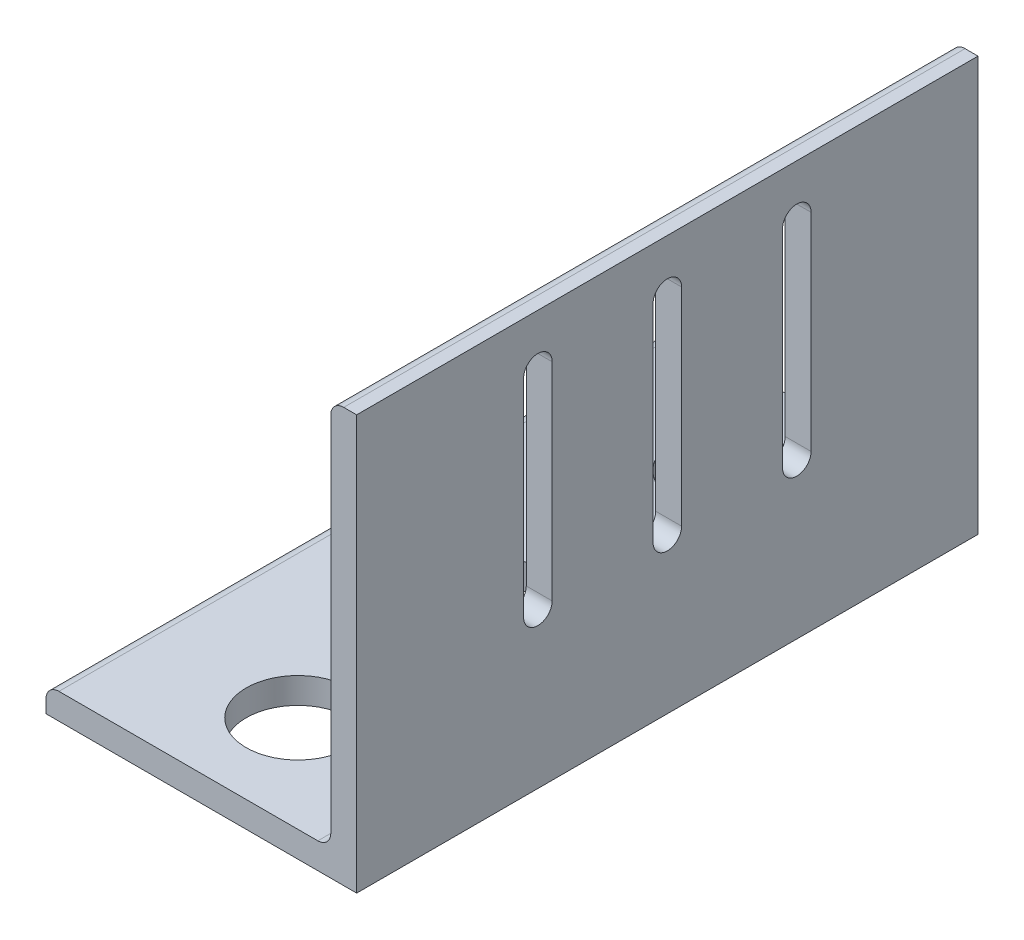
ISO-10303-21;
HEADER;
FILE_DESCRIPTION(('STEP AP214'),'2;1');
FILE_NAME('part.step','',(''),(''),'','','');
FILE_SCHEMA(('AUTOMOTIVE_DESIGN { 1 0 10303 214 1 1 1 1 }'));
ENDSEC;
DATA;
#1=APPLICATION_CONTEXT('core data for automotive mechanical design processes');
#2=APPLICATION_PROTOCOL_DEFINITION('international standard','automotive_design',2000,#1);
#3=PRODUCT_CONTEXT('',#1,'mechanical');
#4=PRODUCT('Part','Part','',(#3));
#5=PRODUCT_RELATED_PRODUCT_CATEGORY('part','',(#4));
#6=PRODUCT_DEFINITION_FORMATION('','',#4);
#7=PRODUCT_DEFINITION_CONTEXT('part definition',#1,'design');
#8=PRODUCT_DEFINITION('design','',#6,#7);
#9=PRODUCT_DEFINITION_SHAPE('','',#8);
#10=(LENGTH_UNIT() NAMED_UNIT(*) SI_UNIT(.MILLI.,.METRE.));
#11=(NAMED_UNIT(*) PLANE_ANGLE_UNIT() SI_UNIT($,.RADIAN.));
#12=(NAMED_UNIT(*) SI_UNIT($,.STERADIAN.) SOLID_ANGLE_UNIT());
#13=UNCERTAINTY_MEASURE_WITH_UNIT(LENGTH_MEASURE(1.E-05),#10,'distance_accuracy_value','');
#14=(GEOMETRIC_REPRESENTATION_CONTEXT(3) GLOBAL_UNCERTAINTY_ASSIGNED_CONTEXT((#13)) GLOBAL_UNIT_ASSIGNED_CONTEXT((#10,
#11,#12)) REPRESENTATION_CONTEXT('',''));
#15=CARTESIAN_POINT('',(0.,0.,0.));
#16=DIRECTION('',(0.,0.,1.));
#17=DIRECTION('',(1.,0.,0.));
#18=AXIS2_PLACEMENT_3D('',#15,#16,#17);
#19=CARTESIAN_POINT('',(-38.1,3.175,76.2));
#20=DIRECTION('',(1.,0.,0.));
#21=DIRECTION('',(0.,0.,-1.));
#22=AXIS2_PLACEMENT_3D('',#19,#20,#21);
#23=PLANE('',#22);
#24=DIRECTION('',(0.,-1.,0.));
#25=VECTOR('',#24,1.);
#26=CARTESIAN_POINT('',(-38.1,3.175,-76.2));
#27=LINE('',#26,#25);
#28=CARTESIAN_POINT('',(-38.1,3.175,-76.2));
#29=VERTEX_POINT('',#28);
#30=CARTESIAN_POINT('',(-38.1,0.,-76.2));
#31=VERTEX_POINT('',#30);
#32=EDGE_CURVE('E222',#29,#31,#27,.T.);
#33=ORIENTED_EDGE('',*,*,#32,.T.);
#34=DIRECTION('',(0.,0.,-1.));
#35=VECTOR('',#34,1.);
#36=CARTESIAN_POINT('',(-38.1,0.,76.2));
#37=LINE('',#36,#35);
#38=CARTESIAN_POINT('',(-38.1,0.,76.2));
#39=VERTEX_POINT('',#38);
#40=EDGE_CURVE('E368',#39,#31,#37,.T.);
#41=ORIENTED_EDGE('',*,*,#40,.F.);
#42=DIRECTION('',(0.,-1.,0.));
#43=VECTOR('',#42,1.);
#44=CARTESIAN_POINT('',(-38.1,3.175,76.2));
#45=LINE('',#44,#43);
#46=CARTESIAN_POINT('',(-38.1,3.175,76.2));
#47=VERTEX_POINT('',#46);
#48=EDGE_CURVE('E281',#47,#39,#45,.T.);
#49=ORIENTED_EDGE('',*,*,#48,.F.);
#50=DIRECTION('',(0.,0.,-1.));
#51=VECTOR('',#50,1.);
#52=CARTESIAN_POINT('',(-38.1,3.175,76.2));
#53=LINE('',#52,#51);
#54=EDGE_CURVE('E310',#47,#29,#53,.T.);
#55=ORIENTED_EDGE('',*,*,#54,.T.);
#56=EDGE_LOOP('',(#33,#41,#49,#55));
#57=FACE_BOUND('',#56,.T.);
#58=ADVANCED_FACE('F41',(#57),#23,.F.);
#59=CARTESIAN_POINT('',(-38.1,0.,76.2));
#60=DIRECTION('',(0.,1.,0.));
#61=DIRECTION('',(0.,0.,1.));
#62=AXIS2_PLACEMENT_3D('',#59,#60,#61);
#63=PLANE('',#62);
#64=CARTESIAN_POINT('',(0.,0.,-52.5));
#65=DIRECTION('',(0.,-1.,0.));
#66=DIRECTION('',(0.,0.,-1.));
#67=AXIS2_PLACEMENT_3D('',#64,#65,#66);
#68=CIRCLE('',#67,12.7);
#69=CARTESIAN_POINT('',(0.,0.,-65.2));
#70=VERTEX_POINT('',#69);
#71=EDGE_CURVE('E567',#70,#70,#68,.T.);
#72=ORIENTED_EDGE('',*,*,#71,.F.);
#73=EDGE_LOOP('',(#72));
#74=FACE_BOUND('',#73,.T.);
#75=CARTESIAN_POINT('',(0.,0.,52.5));
#76=DIRECTION('',(0.,-1.,0.));
#77=DIRECTION('',(0.,0.,-1.));
#78=AXIS2_PLACEMENT_3D('',#75,#76,#77);
#79=CIRCLE('',#78,12.7);
#80=CARTESIAN_POINT('',(0.,0.,39.8));
#81=VERTEX_POINT('',#80);
#82=EDGE_CURVE('E563',#81,#81,#79,.T.);
#83=ORIENTED_EDGE('',*,*,#82,.F.);
#84=EDGE_LOOP('',(#83));
#85=FACE_BOUND('',#84,.T.);
#86=CARTESIAN_POINT('',(0.,0.,0.));
#87=DIRECTION('',(0.,-1.,0.));
#88=DIRECTION('',(0.,0.,-1.));
#89=AXIS2_PLACEMENT_3D('',#86,#87,#88);
#90=CIRCLE('',#89,10.);
#91=CARTESIAN_POINT('',(0.,0.,-10.));
#92=VERTEX_POINT('',#91);
#93=EDGE_CURVE('E416',#92,#92,#90,.T.);
#94=ORIENTED_EDGE('',*,*,#93,.F.);
#95=EDGE_LOOP('',(#94));
#96=FACE_BOUND('',#95,.T.);
#97=DIRECTION('',(1.,0.,0.));
#98=VECTOR('',#97,1.);
#99=CARTESIAN_POINT('',(-38.1,0.,-76.2));
#100=LINE('',#99,#98);
#101=CARTESIAN_POINT('',(38.1,0.,-76.2));
#102=VERTEX_POINT('',#101);
#103=EDGE_CURVE('E314',#31,#102,#100,.T.);
#104=ORIENTED_EDGE('',*,*,#103,.T.);
#105=DIRECTION('',(0.,0.,-1.));
#106=VECTOR('',#105,1.);
#107=CARTESIAN_POINT('',(38.1,0.,76.2));
#108=LINE('',#107,#106);
#109=CARTESIAN_POINT('',(38.1,0.,76.2));
#110=VERTEX_POINT('',#109);
#111=EDGE_CURVE('E364',#110,#102,#108,.T.);
#112=ORIENTED_EDGE('',*,*,#111,.F.);
#113=DIRECTION('',(1.,0.,0.));
#114=VECTOR('',#113,1.);
#115=CARTESIAN_POINT('',(-38.1,0.,76.2));
#116=LINE('',#115,#114);
#117=EDGE_CURVE('E285',#39,#110,#116,.T.);
#118=ORIENTED_EDGE('',*,*,#117,.F.);
#119=ORIENTED_EDGE('',*,*,#40,.T.);
#120=EDGE_LOOP('',(#104,#112,#118,#119));
#121=FACE_BOUND('',#120,.T.);
#122=ADVANCED_FACE('F441',(#74,#85,#96,#121),#63,.F.);
#123=CARTESIAN_POINT('',(38.1,0.,76.2));
#124=DIRECTION('',(-1.,0.,0.));
#125=DIRECTION('',(0.,-1.,0.));
#126=AXIS2_PLACEMENT_3D('',#123,#124,#125);
#127=PLANE('',#126);
#128=DIRECTION('',(0.,-1.,0.));
#129=VECTOR('',#128,1.);
#130=CARTESIAN_POINT('',(38.1,88.9,35.25));
#131=LINE('',#130,#129);
#132=CARTESIAN_POINT('',(38.1,88.9,35.25));
#133=VERTEX_POINT('',#132);
#134=CARTESIAN_POINT('',(38.1,38.1,35.25));
#135=VERTEX_POINT('',#134);
#136=EDGE_CURVE('E204',#133,#135,#131,.T.);
#137=ORIENTED_EDGE('',*,*,#136,.F.);
#138=CARTESIAN_POINT('',(38.1,88.9,31.75));
#139=DIRECTION('',(1.,0.,0.));
#140=DIRECTION('',(0.,1.,0.));
#141=AXIS2_PLACEMENT_3D('',#138,#139,#140);
#142=CIRCLE('',#141,3.5);
#143=CARTESIAN_POINT('',(38.1,88.9,28.25));
#144=VERTEX_POINT('',#143);
#145=EDGE_CURVE('E58',#144,#133,#142,.T.);
#146=ORIENTED_EDGE('',*,*,#145,.F.);
#147=DIRECTION('',(0.,1.,0.));
#148=VECTOR('',#147,1.);
#149=CARTESIAN_POINT('',(38.1,88.9,28.25));
#150=LINE('',#149,#148);
#151=CARTESIAN_POINT('',(38.1,38.1,28.25));
#152=VERTEX_POINT('',#151);
#153=EDGE_CURVE('E212',#152,#144,#150,.T.);
#154=ORIENTED_EDGE('',*,*,#153,.F.);
#155=CARTESIAN_POINT('',(38.1,38.1,31.75));
#156=DIRECTION('',(1.,0.,0.));
#157=DIRECTION('',(0.,1.,0.));
#158=AXIS2_PLACEMENT_3D('',#155,#156,#157);
#159=CIRCLE('',#158,3.5);
#160=EDGE_CURVE('E193',#135,#152,#159,.T.);
#161=ORIENTED_EDGE('',*,*,#160,.F.);
#162=EDGE_LOOP('',(#137,#146,#154,#161));
#163=FACE_BOUND('',#162,.T.);
#164=DIRECTION('',(0.,-1.,0.));
#165=VECTOR('',#164,1.);
#166=CARTESIAN_POINT('',(38.1,88.9,-28.25));
#167=LINE('',#166,#165);
#168=CARTESIAN_POINT('',(38.1,88.9,-28.25));
#169=VERTEX_POINT('',#168);
#170=CARTESIAN_POINT('',(38.1,38.1,-28.25));
#171=VERTEX_POINT('',#170);
#172=EDGE_CURVE('E229',#169,#171,#167,.T.);
#173=ORIENTED_EDGE('',*,*,#172,.F.);
#174=CARTESIAN_POINT('',(38.1,88.9,-31.75));
#175=DIRECTION('',(1.,0.,0.));
#176=DIRECTION('',(0.,-1.,0.));
#177=AXIS2_PLACEMENT_3D('',#174,#175,#176);
#178=CIRCLE('',#177,3.5);
#179=CARTESIAN_POINT('',(38.1,88.9,-35.25));
#180=VERTEX_POINT('',#179);
#181=EDGE_CURVE('E66',#180,#169,#178,.T.);
#182=ORIENTED_EDGE('',*,*,#181,.F.);
#183=DIRECTION('',(0.,1.,0.));
#184=VECTOR('',#183,1.);
#185=CARTESIAN_POINT('',(38.1,88.9,-35.25));
#186=LINE('',#185,#184);
#187=CARTESIAN_POINT('',(38.1,38.1,-35.25));
#188=VERTEX_POINT('',#187);
#189=EDGE_CURVE('E238',#188,#180,#186,.T.);
#190=ORIENTED_EDGE('',*,*,#189,.F.);
#191=CARTESIAN_POINT('',(38.1,38.1,-31.75));
#192=DIRECTION('',(1.,0.,0.));
#193=DIRECTION('',(0.,-1.,0.));
#194=AXIS2_PLACEMENT_3D('',#191,#192,#193);
#195=CIRCLE('',#194,3.5);
#196=EDGE_CURVE('E234',#171,#188,#195,.T.);
#197=ORIENTED_EDGE('',*,*,#196,.F.);
#198=EDGE_LOOP('',(#173,#182,#190,#197));
#199=FACE_BOUND('',#198,.T.);
#200=DIRECTION('',(0.,-1.,0.));
#201=VECTOR('',#200,1.);
#202=CARTESIAN_POINT('',(38.1,88.9,3.5));
#203=LINE('',#202,#201);
#204=CARTESIAN_POINT('',(38.1,88.9,3.5));
#205=VERTEX_POINT('',#204);
#206=CARTESIAN_POINT('',(38.1,38.1,3.50000000000002));
#207=VERTEX_POINT('',#206);
#208=EDGE_CURVE('E257',#205,#207,#203,.T.);
#209=ORIENTED_EDGE('',*,*,#208,.F.);
#210=CARTESIAN_POINT('',(38.1,88.9,0.));
#211=DIRECTION('',(1.,0.,0.));
#212=DIRECTION('',(0.,1.,0.));
#213=AXIS2_PLACEMENT_3D('',#210,#211,#212);
#214=CIRCLE('',#213,3.5);
#215=CARTESIAN_POINT('',(38.1,88.9,-3.5));
#216=VERTEX_POINT('',#215);
#217=EDGE_CURVE('E254',#216,#205,#214,.T.);
#218=ORIENTED_EDGE('',*,*,#217,.F.);
#219=DIRECTION('',(0.,1.,0.));
#220=VECTOR('',#219,1.);
#221=CARTESIAN_POINT('',(38.1,88.9,-3.5));
#222=LINE('',#221,#220);
#223=CARTESIAN_POINT('',(38.1,38.1,-3.49999999999999));
#224=VERTEX_POINT('',#223);
#225=EDGE_CURVE('E265',#224,#216,#222,.T.);
#226=ORIENTED_EDGE('',*,*,#225,.F.);
#227=CARTESIAN_POINT('',(38.1,38.1,0.));
#228=DIRECTION('',(1.,0.,0.));
#229=DIRECTION('',(0.,1.,0.));
#230=AXIS2_PLACEMENT_3D('',#227,#228,#229);
#231=CIRCLE('',#230,3.5);
#232=EDGE_CURVE('E261',#207,#224,#231,.T.);
#233=ORIENTED_EDGE('',*,*,#232,.F.);
#234=EDGE_LOOP('',(#209,#218,#226,#233));
#235=FACE_BOUND('',#234,.T.);
#236=DIRECTION('',(0.,1.,0.));
#237=VECTOR('',#236,1.);
#238=CARTESIAN_POINT('',(38.1,0.,-76.2));
#239=LINE('',#238,#237);
#240=CARTESIAN_POINT('',(38.1,101.6,-76.2));
#241=VERTEX_POINT('',#240);
#242=EDGE_CURVE('E317',#102,#241,#239,.T.);
#243=ORIENTED_EDGE('',*,*,#242,.T.);
#244=DIRECTION('',(0.,0.,-1.));
#245=VECTOR('',#244,1.);
#246=CARTESIAN_POINT('',(38.1,101.6,76.2));
#247=LINE('',#246,#245);
#248=CARTESIAN_POINT('',(38.1,101.6,76.2));
#249=VERTEX_POINT('',#248);
#250=EDGE_CURVE('E360',#249,#241,#247,.T.);
#251=ORIENTED_EDGE('',*,*,#250,.F.);
#252=DIRECTION('',(0.,1.,0.));
#253=VECTOR('',#252,1.);
#254=CARTESIAN_POINT('',(38.1,0.,76.2));
#255=LINE('',#254,#253);
#256=EDGE_CURVE('E289',#110,#249,#255,.T.);
#257=ORIENTED_EDGE('',*,*,#256,.F.);
#258=ORIENTED_EDGE('',*,*,#111,.T.);
#259=EDGE_LOOP('',(#243,#251,#257,#258));
#260=FACE_BOUND('',#259,.T.);
#261=ADVANCED_FACE('F209',(#163,#199,#235,#260),#127,.F.);
#262=CARTESIAN_POINT('',(34.925,101.6,76.2));
#263=DIRECTION('',(0.,-1.,0.));
#264=DIRECTION('',(1.,0.,0.));
#265=AXIS2_PLACEMENT_3D('',#262,#263,#264);
#266=PLANE('',#265);
#267=DIRECTION('',(-1.,0.,0.));
#268=VECTOR('',#267,1.);
#269=CARTESIAN_POINT('',(34.925,101.6,-76.2));
#270=LINE('',#269,#268);
#271=CARTESIAN_POINT('',(34.925,101.6,-76.2));
#272=VERTEX_POINT('',#271);
#273=EDGE_CURVE('E320',#241,#272,#270,.T.);
#274=ORIENTED_EDGE('',*,*,#273,.T.);
#275=DIRECTION('',(0.,0.,-1.));
#276=VECTOR('',#275,1.);
#277=CARTESIAN_POINT('',(34.925,101.6,76.2));
#278=LINE('',#277,#276);
#279=CARTESIAN_POINT('',(34.925,101.6,76.2));
#280=VERTEX_POINT('',#279);
#281=EDGE_CURVE('E356',#280,#272,#278,.T.);
#282=ORIENTED_EDGE('',*,*,#281,.F.);
#283=DIRECTION('',(-1.,0.,0.));
#284=VECTOR('',#283,1.);
#285=CARTESIAN_POINT('',(34.925,101.6,76.2));
#286=LINE('',#285,#284);
#287=EDGE_CURVE('E292',#249,#280,#286,.T.);
#288=ORIENTED_EDGE('',*,*,#287,.F.);
#289=ORIENTED_EDGE('',*,*,#250,.T.);
#290=EDGE_LOOP('',(#274,#282,#288,#289));
#291=FACE_BOUND('',#290,.T.);
#292=ADVANCED_FACE('F485',(#291),#266,.F.);
#293=CARTESIAN_POINT('',(34.925,98.425,76.2));
#294=DIRECTION('',(0.,0.,-1.));
#295=DIRECTION('',(-1.,0.,0.));
#296=AXIS2_PLACEMENT_3D('',#293,#294,#295);
#297=CYLINDRICAL_SURFACE('',#296,3.175);
#298=CARTESIAN_POINT('',(34.925,98.425,-76.2));
#299=DIRECTION('',(0.,0.,1.));
#300=DIRECTION('',(-1.,0.,0.));
#301=AXIS2_PLACEMENT_3D('',#298,#299,#300);
#302=CIRCLE('',#301,3.175);
#303=CARTESIAN_POINT('',(31.75,98.425,-76.2));
#304=VERTEX_POINT('',#303);
#305=EDGE_CURVE('E323',#272,#304,#302,.T.);
#306=ORIENTED_EDGE('',*,*,#305,.T.);
#307=DIRECTION('',(0.,0.,-1.));
#308=VECTOR('',#307,1.);
#309=CARTESIAN_POINT('',(31.75,98.425,76.2));
#310=LINE('',#309,#308);
#311=CARTESIAN_POINT('',(31.75,98.425,76.2));
#312=VERTEX_POINT('',#311);
#313=EDGE_CURVE('E352',#312,#304,#310,.T.);
#314=ORIENTED_EDGE('',*,*,#313,.F.);
#315=CARTESIAN_POINT('',(34.925,98.425,76.2));
#316=DIRECTION('',(0.,0.,1.));
#317=DIRECTION('',(-1.,0.,0.));
#318=AXIS2_PLACEMENT_3D('',#315,#316,#317);
#319=CIRCLE('',#318,3.175);
#320=EDGE_CURVE('E295',#280,#312,#319,.T.);
#321=ORIENTED_EDGE('',*,*,#320,.F.);
#322=ORIENTED_EDGE('',*,*,#281,.T.);
#323=EDGE_LOOP('',(#306,#314,#321,#322));
#324=FACE_BOUND('',#323,.T.);
#325=ADVANCED_FACE('F482',(#324),#297,.T.);
#326=CARTESIAN_POINT('',(31.75,98.425,76.2));
#327=DIRECTION('',(1.,0.,0.));
#328=DIRECTION('',(0.,1.,0.));
#329=AXIS2_PLACEMENT_3D('',#326,#327,#328);
#330=PLANE('',#329);
#331=DIRECTION('',(0.,1.,0.));
#332=VECTOR('',#331,1.);
#333=CARTESIAN_POINT('',(31.75,98.425,28.25));
#334=LINE('',#333,#332);
#335=CARTESIAN_POINT('',(31.75,38.1,28.25));
#336=VERTEX_POINT('',#335);
#337=CARTESIAN_POINT('',(31.75,88.9,28.25));
#338=VERTEX_POINT('',#337);
#339=EDGE_CURVE('E50',#336,#338,#334,.T.);
#340=ORIENTED_EDGE('',*,*,#339,.T.);
#341=CARTESIAN_POINT('',(31.75,88.9,31.75));
#342=DIRECTION('',(1.,0.,0.));
#343=DIRECTION('',(0.,1.,0.));
#344=AXIS2_PLACEMENT_3D('',#341,#342,#343);
#345=CIRCLE('',#344,3.5);
#346=CARTESIAN_POINT('',(31.75,88.9,35.25));
#347=VERTEX_POINT('',#346);
#348=EDGE_CURVE('E11',#338,#347,#345,.T.);
#349=ORIENTED_EDGE('',*,*,#348,.T.);
#350=DIRECTION('',(0.,-1.,0.));
#351=VECTOR('',#350,1.);
#352=CARTESIAN_POINT('',(31.75,98.425,35.25));
#353=LINE('',#352,#351);
#354=CARTESIAN_POINT('',(31.75,38.1,35.25));
#355=VERTEX_POINT('',#354);
#356=EDGE_CURVE('E404',#347,#355,#353,.T.);
#357=ORIENTED_EDGE('',*,*,#356,.T.);
#358=CARTESIAN_POINT('',(31.75,38.1,31.75));
#359=DIRECTION('',(1.,0.,0.));
#360=DIRECTION('',(0.,1.,0.));
#361=AXIS2_PLACEMENT_3D('',#358,#359,#360);
#362=CIRCLE('',#361,3.5);
#363=EDGE_CURVE('E196',#355,#336,#362,.T.);
#364=ORIENTED_EDGE('',*,*,#363,.T.);
#365=EDGE_LOOP('',(#340,#349,#357,#364));
#366=FACE_BOUND('',#365,.T.);
#367=DIRECTION('',(0.,1.,0.));
#368=VECTOR('',#367,1.);
#369=CARTESIAN_POINT('',(31.75,98.425,-35.25));
#370=LINE('',#369,#368);
#371=CARTESIAN_POINT('',(31.75,38.1,-35.25));
#372=VERTEX_POINT('',#371);
#373=CARTESIAN_POINT('',(31.75,88.9,-35.25));
#374=VERTEX_POINT('',#373);
#375=EDGE_CURVE('E396',#372,#374,#370,.T.);
#376=ORIENTED_EDGE('',*,*,#375,.T.);
#377=CARTESIAN_POINT('',(31.75,88.9,-31.75));
#378=DIRECTION('',(1.,0.,0.));
#379=DIRECTION('',(0.,1.,0.));
#380=AXIS2_PLACEMENT_3D('',#377,#378,#379);
#381=CIRCLE('',#380,3.5);
#382=CARTESIAN_POINT('',(31.75,88.9,-28.25));
#383=VERTEX_POINT('',#382);
#384=EDGE_CURVE('E400',#374,#383,#381,.T.);
#385=ORIENTED_EDGE('',*,*,#384,.T.);
#386=DIRECTION('',(0.,-1.,0.));
#387=VECTOR('',#386,1.);
#388=CARTESIAN_POINT('',(31.75,98.425,-28.25));
#389=LINE('',#388,#387);
#390=CARTESIAN_POINT('',(31.75,38.1,-28.25));
#391=VERTEX_POINT('',#390);
#392=EDGE_CURVE('E388',#383,#391,#389,.T.);
#393=ORIENTED_EDGE('',*,*,#392,.T.);
#394=CARTESIAN_POINT('',(31.75,38.1,-31.75));
#395=DIRECTION('',(1.,0.,0.));
#396=DIRECTION('',(0.,1.,0.));
#397=AXIS2_PLACEMENT_3D('',#394,#395,#396);
#398=CIRCLE('',#397,3.5);
#399=EDGE_CURVE('E392',#391,#372,#398,.T.);
#400=ORIENTED_EDGE('',*,*,#399,.T.);
#401=EDGE_LOOP('',(#376,#385,#393,#400));
#402=FACE_BOUND('',#401,.T.);
#403=DIRECTION('',(0.,1.,0.));
#404=VECTOR('',#403,1.);
#405=CARTESIAN_POINT('',(31.75,98.425,-3.5));
#406=LINE('',#405,#404);
#407=CARTESIAN_POINT('',(31.75,38.1,-3.49999999999999));
#408=VERTEX_POINT('',#407);
#409=CARTESIAN_POINT('',(31.75,88.9,-3.5));
#410=VERTEX_POINT('',#409);
#411=EDGE_CURVE('E380',#408,#410,#406,.T.);
#412=ORIENTED_EDGE('',*,*,#411,.T.);
#413=CARTESIAN_POINT('',(31.75,88.9,0.));
#414=DIRECTION('',(1.,0.,0.));
#415=DIRECTION('',(0.,1.,0.));
#416=AXIS2_PLACEMENT_3D('',#413,#414,#415);
#417=CIRCLE('',#416,3.5);
#418=CARTESIAN_POINT('',(31.75,88.9,3.5));
#419=VERTEX_POINT('',#418);
#420=EDGE_CURVE('E384',#410,#419,#417,.T.);
#421=ORIENTED_EDGE('',*,*,#420,.T.);
#422=DIRECTION('',(0.,-1.,0.));
#423=VECTOR('',#422,1.);
#424=CARTESIAN_POINT('',(31.75,98.425,3.5));
#425=LINE('',#424,#423);
#426=CARTESIAN_POINT('',(31.75,38.1,3.50000000000001));
#427=VERTEX_POINT('',#426);
#428=EDGE_CURVE('E372',#419,#427,#425,.T.);
#429=ORIENTED_EDGE('',*,*,#428,.T.);
#430=CARTESIAN_POINT('',(31.75,38.1,0.));
#431=DIRECTION('',(1.,0.,0.));
#432=DIRECTION('',(0.,1.,0.));
#433=AXIS2_PLACEMENT_3D('',#430,#431,#432);
#434=CIRCLE('',#433,3.5);
#435=EDGE_CURVE('E376',#427,#408,#434,.T.);
#436=ORIENTED_EDGE('',*,*,#435,.T.);
#437=EDGE_LOOP('',(#412,#421,#429,#436));
#438=FACE_BOUND('',#437,.T.);
#439=DIRECTION('',(0.,-1.,0.));
#440=VECTOR('',#439,1.);
#441=CARTESIAN_POINT('',(31.75,98.425,-76.2));
#442=LINE('',#441,#440);
#443=CARTESIAN_POINT('',(31.75,9.52499999999999,-76.2));
#444=VERTEX_POINT('',#443);
#445=EDGE_CURVE('E326',#304,#444,#442,.T.);
#446=ORIENTED_EDGE('',*,*,#445,.T.);
#447=DIRECTION('',(0.,0.,-1.));
#448=VECTOR('',#447,1.);
#449=CARTESIAN_POINT('',(31.75,9.52499999999999,76.2));
#450=LINE('',#449,#448);
#451=CARTESIAN_POINT('',(31.75,9.52499999999999,76.2));
#452=VERTEX_POINT('',#451);
#453=EDGE_CURVE('E348',#452,#444,#450,.T.);
#454=ORIENTED_EDGE('',*,*,#453,.F.);
#455=DIRECTION('',(0.,-1.,0.));
#456=VECTOR('',#455,1.);
#457=CARTESIAN_POINT('',(31.75,98.425,76.2));
#458=LINE('',#457,#456);
#459=EDGE_CURVE('E298',#312,#452,#458,.T.);
#460=ORIENTED_EDGE('',*,*,#459,.F.);
#461=ORIENTED_EDGE('',*,*,#313,.T.);
#462=EDGE_LOOP('',(#446,#454,#460,#461));
#463=FACE_BOUND('',#462,.T.);
#464=ADVANCED_FACE('F478',(#366,#402,#438,#463),#330,.F.);
#465=CARTESIAN_POINT('',(28.575,9.52499999999999,76.2));
#466=DIRECTION('',(0.,0.,-1.));
#467=DIRECTION('',(-1.,0.,0.));
#468=AXIS2_PLACEMENT_3D('',#465,#466,#467);
#469=CYLINDRICAL_SURFACE('',#468,3.175);
#470=CARTESIAN_POINT('',(28.575,9.52499999999999,-76.2));
#471=DIRECTION('',(0.,0.,-1.));
#472=DIRECTION('',(-1.,0.,0.));
#473=AXIS2_PLACEMENT_3D('',#470,#471,#472);
#474=CIRCLE('',#473,3.175);
#475=CARTESIAN_POINT('',(28.575,6.35,-76.2));
#476=VERTEX_POINT('',#475);
#477=EDGE_CURVE('E329',#444,#476,#474,.T.);
#478=ORIENTED_EDGE('',*,*,#477,.T.);
#479=DIRECTION('',(0.,0.,-1.));
#480=VECTOR('',#479,1.);
#481=CARTESIAN_POINT('',(28.575,6.35,76.2));
#482=LINE('',#481,#480);
#483=CARTESIAN_POINT('',(28.575,6.35,76.2));
#484=VERTEX_POINT('',#483);
#485=EDGE_CURVE('E344',#484,#476,#482,.T.);
#486=ORIENTED_EDGE('',*,*,#485,.F.);
#487=CARTESIAN_POINT('',(28.575,9.52499999999999,76.2));
#488=DIRECTION('',(0.,0.,-1.));
#489=DIRECTION('',(-1.,0.,0.));
#490=AXIS2_PLACEMENT_3D('',#487,#488,#489);
#491=CIRCLE('',#490,3.175);
#492=EDGE_CURVE('E301',#452,#484,#491,.T.);
#493=ORIENTED_EDGE('',*,*,#492,.F.);
#494=ORIENTED_EDGE('',*,*,#453,.T.);
#495=EDGE_LOOP('',(#478,#486,#493,#494));
#496=FACE_BOUND('',#495,.T.);
#497=ADVANCED_FACE('F473',(#496),#469,.F.);
#498=CARTESIAN_POINT('',(28.575,6.35,76.2));
#499=DIRECTION('',(0.,-1.,0.));
#500=DIRECTION('',(1.,0.,0.));
#501=AXIS2_PLACEMENT_3D('',#498,#499,#500);
#502=PLANE('',#501);
#503=CARTESIAN_POINT('',(0.,6.35,-52.5));
#504=DIRECTION('',(0.,-1.,0.));
#505=DIRECTION('',(1.,0.,0.));
#506=AXIS2_PLACEMENT_3D('',#503,#504,#505);
#507=CIRCLE('',#506,12.7);
#508=CARTESIAN_POINT('',(12.7,6.35,-52.5));
#509=VERTEX_POINT('',#508);
#510=EDGE_CURVE('E44',#509,#509,#507,.T.);
#511=ORIENTED_EDGE('',*,*,#510,.T.);
#512=EDGE_LOOP('',(#511));
#513=FACE_BOUND('',#512,.T.);
#514=CARTESIAN_POINT('',(0.,6.35,52.5));
#515=DIRECTION('',(0.,-1.,0.));
#516=DIRECTION('',(1.,0.,0.));
#517=AXIS2_PLACEMENT_3D('',#514,#515,#516);
#518=CIRCLE('',#517,12.7);
#519=CARTESIAN_POINT('',(12.7,6.35,52.5));
#520=VERTEX_POINT('',#519);
#521=EDGE_CURVE('E415',#520,#520,#518,.T.);
#522=ORIENTED_EDGE('',*,*,#521,.T.);
#523=EDGE_LOOP('',(#522));
#524=FACE_BOUND('',#523,.T.);
#525=CARTESIAN_POINT('',(0.,6.35,0.));
#526=DIRECTION('',(0.,-1.,0.));
#527=DIRECTION('',(1.,0.,0.));
#528=AXIS2_PLACEMENT_3D('',#525,#526,#527);
#529=CIRCLE('',#528,10.);
#530=CARTESIAN_POINT('',(10.,6.35,0.));
#531=VERTEX_POINT('',#530);
#532=EDGE_CURVE('E412',#531,#531,#529,.T.);
#533=ORIENTED_EDGE('',*,*,#532,.T.);
#534=EDGE_LOOP('',(#533));
#535=FACE_BOUND('',#534,.T.);
#536=DIRECTION('',(-1.,0.,0.));
#537=VECTOR('',#536,1.);
#538=CARTESIAN_POINT('',(28.575,6.35,-76.2));
#539=LINE('',#538,#537);
#540=CARTESIAN_POINT('',(-34.925,6.34999999999999,-76.2));
#541=VERTEX_POINT('',#540);
#542=EDGE_CURVE('E332',#476,#541,#539,.T.);
#543=ORIENTED_EDGE('',*,*,#542,.T.);
#544=DIRECTION('',(0.,0.,-1.));
#545=VECTOR('',#544,1.);
#546=CARTESIAN_POINT('',(-34.925,6.34999999999999,76.2));
#547=LINE('',#546,#545);
#548=CARTESIAN_POINT('',(-34.925,6.34999999999999,76.2));
#549=VERTEX_POINT('',#548);
#550=EDGE_CURVE('E340',#549,#541,#547,.T.);
#551=ORIENTED_EDGE('',*,*,#550,.F.);
#552=DIRECTION('',(-1.,0.,0.));
#553=VECTOR('',#552,1.);
#554=CARTESIAN_POINT('',(28.575,6.35,76.2));
#555=LINE('',#554,#553);
#556=EDGE_CURVE('E304',#484,#549,#555,.T.);
#557=ORIENTED_EDGE('',*,*,#556,.F.);
#558=ORIENTED_EDGE('',*,*,#485,.T.);
#559=EDGE_LOOP('',(#543,#551,#557,#558));
#560=FACE_BOUND('',#559,.T.);
#561=ADVANCED_FACE('F425',(#513,#524,#535,#560),#502,.F.);
#562=CARTESIAN_POINT('',(-34.925,3.175,76.2));
#563=DIRECTION('',(0.,0.,-1.));
#564=DIRECTION('',(-1.,0.,0.));
#565=AXIS2_PLACEMENT_3D('',#562,#563,#564);
#566=CYLINDRICAL_SURFACE('',#565,3.175);
#567=CARTESIAN_POINT('',(-34.925,3.175,-76.2));
#568=DIRECTION('',(0.,0.,1.));
#569=DIRECTION('',(-1.,0.,0.));
#570=AXIS2_PLACEMENT_3D('',#567,#568,#569);
#571=CIRCLE('',#570,3.175);
#572=EDGE_CURVE('E286',#541,#29,#571,.T.);
#573=ORIENTED_EDGE('',*,*,#572,.T.);
#574=ORIENTED_EDGE('',*,*,#54,.F.);
#575=CARTESIAN_POINT('',(-34.925,3.175,76.2));
#576=DIRECTION('',(0.,0.,1.));
#577=DIRECTION('',(-1.,0.,0.));
#578=AXIS2_PLACEMENT_3D('',#575,#576,#577);
#579=CIRCLE('',#578,3.175);
#580=EDGE_CURVE('E307',#549,#47,#579,.T.);
#581=ORIENTED_EDGE('',*,*,#580,.F.);
#582=ORIENTED_EDGE('',*,*,#550,.T.);
#583=EDGE_LOOP('',(#573,#574,#581,#582));
#584=FACE_BOUND('',#583,.T.);
#585=ADVANCED_FACE('F466',(#584),#566,.T.);
#586=CARTESIAN_POINT('',(34.925,98.425,76.2));
#587=DIRECTION('',(0.,0.,-1.));
#588=DIRECTION('',(-1.,0.,0.));
#589=AXIS2_PLACEMENT_3D('',#586,#587,#588);
#590=PLANE('',#589);
#591=ORIENTED_EDGE('',*,*,#48,.T.);
#592=ORIENTED_EDGE('',*,*,#117,.T.);
#593=ORIENTED_EDGE('',*,*,#256,.T.);
#594=ORIENTED_EDGE('',*,*,#287,.T.);
#595=ORIENTED_EDGE('',*,*,#320,.T.);
#596=ORIENTED_EDGE('',*,*,#459,.T.);
#597=ORIENTED_EDGE('',*,*,#492,.T.);
#598=ORIENTED_EDGE('',*,*,#556,.T.);
#599=ORIENTED_EDGE('',*,*,#580,.T.);
#600=EDGE_LOOP('',(#591,#592,#593,#594,#595,#596,#597,#598,#599));
#601=FACE_BOUND('',#600,.T.);
#602=ADVANCED_FACE('F461',(#601),#590,.F.);
#603=CARTESIAN_POINT('',(34.925,98.425,-76.2));
#604=DIRECTION('',(0.,0.,-1.));
#605=DIRECTION('',(-1.,0.,0.));
#606=AXIS2_PLACEMENT_3D('',#603,#604,#605);
#607=PLANE('',#606);
#608=ORIENTED_EDGE('',*,*,#32,.F.);
#609=ORIENTED_EDGE('',*,*,#572,.F.);
#610=ORIENTED_EDGE('',*,*,#542,.F.);
#611=ORIENTED_EDGE('',*,*,#477,.F.);
#612=ORIENTED_EDGE('',*,*,#445,.F.);
#613=ORIENTED_EDGE('',*,*,#305,.F.);
#614=ORIENTED_EDGE('',*,*,#273,.F.);
#615=ORIENTED_EDGE('',*,*,#242,.F.);
#616=ORIENTED_EDGE('',*,*,#103,.F.);
#617=EDGE_LOOP('',(#608,#609,#610,#611,#612,#613,#614,#615,#616));
#618=FACE_BOUND('',#617,.T.);
#619=ADVANCED_FACE('F453',(#618),#607,.T.);
#620=CARTESIAN_POINT('',(28.1,88.9,0.));
#621=DIRECTION('',(1.,0.,0.));
#622=DIRECTION('',(0.,1.,0.));
#623=AXIS2_PLACEMENT_3D('',#620,#621,#622);
#624=CYLINDRICAL_SURFACE('',#623,3.5);
#625=DIRECTION('',(1.,0.,0.));
#626=VECTOR('',#625,1.);
#627=CARTESIAN_POINT('',(28.1,88.9,-3.5));
#628=LINE('',#627,#626);
#629=EDGE_CURVE('E230',#410,#216,#628,.T.);
#630=ORIENTED_EDGE('',*,*,#629,.T.);
#631=ORIENTED_EDGE('',*,*,#217,.T.);
#632=DIRECTION('',(1.,0.,0.));
#633=VECTOR('',#632,1.);
#634=CARTESIAN_POINT('',(28.1,88.9,3.5));
#635=LINE('',#634,#633);
#636=EDGE_CURVE('E269',#419,#205,#635,.T.);
#637=ORIENTED_EDGE('',*,*,#636,.F.);
#638=ORIENTED_EDGE('',*,*,#420,.F.);
#639=EDGE_LOOP('',(#630,#631,#637,#638));
#640=FACE_BOUND('',#639,.T.);
#641=ADVANCED_FACE('F509',(#640),#624,.F.);
#642=CARTESIAN_POINT('',(28.1,88.9,-3.5));
#643=DIRECTION('',(0.,0.,-1.));
#644=DIRECTION('',(0.,1.,0.));
#645=AXIS2_PLACEMENT_3D('',#642,#643,#644);
#646=PLANE('',#645);
#647=DIRECTION('',(1.,0.,0.));
#648=VECTOR('',#647,1.);
#649=CARTESIAN_POINT('',(28.1,38.1,-3.49999999999999));
#650=LINE('',#649,#648);
#651=EDGE_CURVE('E272',#408,#224,#650,.T.);
#652=ORIENTED_EDGE('',*,*,#651,.T.);
#653=ORIENTED_EDGE('',*,*,#225,.T.);
#654=ORIENTED_EDGE('',*,*,#629,.F.);
#655=ORIENTED_EDGE('',*,*,#411,.F.);
#656=EDGE_LOOP('',(#652,#653,#654,#655));
#657=FACE_BOUND('',#656,.T.);
#658=ADVANCED_FACE('F514',(#657),#646,.F.);
#659=CARTESIAN_POINT('',(28.1,38.1,0.));
#660=DIRECTION('',(1.,0.,0.));
#661=DIRECTION('',(0.,1.,0.));
#662=AXIS2_PLACEMENT_3D('',#659,#660,#661);
#663=CYLINDRICAL_SURFACE('',#662,3.5);
#664=DIRECTION('',(1.,0.,0.));
#665=VECTOR('',#664,1.);
#666=CARTESIAN_POINT('',(28.1,38.1,3.50000000000002));
#667=LINE('',#666,#665);
#668=EDGE_CURVE('E275',#427,#207,#667,.T.);
#669=ORIENTED_EDGE('',*,*,#668,.T.);
#670=ORIENTED_EDGE('',*,*,#232,.T.);
#671=ORIENTED_EDGE('',*,*,#651,.F.);
#672=ORIENTED_EDGE('',*,*,#435,.F.);
#673=EDGE_LOOP('',(#669,#670,#671,#672));
#674=FACE_BOUND('',#673,.T.);
#675=ADVANCED_FACE('F520',(#674),#663,.F.);
#676=CARTESIAN_POINT('',(28.1,88.9,3.5));
#677=DIRECTION('',(0.,0.,1.));
#678=DIRECTION('',(0.,-1.,0.));
#679=AXIS2_PLACEMENT_3D('',#676,#677,#678);
#680=PLANE('',#679);
#681=ORIENTED_EDGE('',*,*,#636,.T.);
#682=ORIENTED_EDGE('',*,*,#208,.T.);
#683=ORIENTED_EDGE('',*,*,#668,.F.);
#684=ORIENTED_EDGE('',*,*,#428,.F.);
#685=EDGE_LOOP('',(#681,#682,#683,#684));
#686=FACE_BOUND('',#685,.T.);
#687=ADVANCED_FACE('F516',(#686),#680,.F.);
#688=CARTESIAN_POINT('',(28.1,88.9,-31.75));
#689=DIRECTION('',(1.,0.,0.));
#690=DIRECTION('',(0.,1.,0.));
#691=AXIS2_PLACEMENT_3D('',#688,#689,#690);
#692=CYLINDRICAL_SURFACE('',#691,3.5);
#693=DIRECTION('',(1.,0.,0.));
#694=VECTOR('',#693,1.);
#695=CARTESIAN_POINT('',(28.1,88.9,-35.25));
#696=LINE('',#695,#694);
#697=EDGE_CURVE('E243',#374,#180,#696,.T.);
#698=ORIENTED_EDGE('',*,*,#697,.T.);
#699=ORIENTED_EDGE('',*,*,#181,.T.);
#700=DIRECTION('',(1.,0.,0.));
#701=VECTOR('',#700,1.);
#702=CARTESIAN_POINT('',(28.1,88.9,-28.25));
#703=LINE('',#702,#701);
#704=EDGE_CURVE('E242',#383,#169,#703,.T.);
#705=ORIENTED_EDGE('',*,*,#704,.F.);
#706=ORIENTED_EDGE('',*,*,#384,.F.);
#707=EDGE_LOOP('',(#698,#699,#705,#706));
#708=FACE_BOUND('',#707,.T.);
#709=ADVANCED_FACE('F519',(#708),#692,.F.);
#710=CARTESIAN_POINT('',(28.1,88.9,-35.25));
#711=DIRECTION('',(0.,0.,-1.));
#712=DIRECTION('',(-1.,0.,0.));
#713=AXIS2_PLACEMENT_3D('',#710,#711,#712);
#714=PLANE('',#713);
#715=DIRECTION('',(1.,0.,0.));
#716=VECTOR('',#715,1.);
#717=CARTESIAN_POINT('',(28.1,38.1,-35.25));
#718=LINE('',#717,#716);
#719=EDGE_CURVE('E246',#372,#188,#718,.T.);
#720=ORIENTED_EDGE('',*,*,#719,.T.);
#721=ORIENTED_EDGE('',*,*,#189,.T.);
#722=ORIENTED_EDGE('',*,*,#697,.F.);
#723=ORIENTED_EDGE('',*,*,#375,.F.);
#724=EDGE_LOOP('',(#720,#721,#722,#723));
#725=FACE_BOUND('',#724,.T.);
#726=ADVANCED_FACE('F530',(#725),#714,.F.);
#727=CARTESIAN_POINT('',(28.1,38.1,-31.75));
#728=DIRECTION('',(1.,0.,0.));
#729=DIRECTION('',(0.,1.,0.));
#730=AXIS2_PLACEMENT_3D('',#727,#728,#729);
#731=CYLINDRICAL_SURFACE('',#730,3.5);
#732=DIRECTION('',(1.,0.,0.));
#733=VECTOR('',#732,1.);
#734=CARTESIAN_POINT('',(28.1,38.1,-28.25));
#735=LINE('',#734,#733);
#736=EDGE_CURVE('E249',#391,#171,#735,.T.);
#737=ORIENTED_EDGE('',*,*,#736,.T.);
#738=ORIENTED_EDGE('',*,*,#196,.T.);
#739=ORIENTED_EDGE('',*,*,#719,.F.);
#740=ORIENTED_EDGE('',*,*,#399,.F.);
#741=EDGE_LOOP('',(#737,#738,#739,#740));
#742=FACE_BOUND('',#741,.T.);
#743=ADVANCED_FACE('F535',(#742),#731,.F.);
#744=CARTESIAN_POINT('',(28.1,88.9,-28.25));
#745=DIRECTION('',(0.,0.,1.));
#746=DIRECTION('',(1.,0.,0.));
#747=AXIS2_PLACEMENT_3D('',#744,#745,#746);
#748=PLANE('',#747);
#749=ORIENTED_EDGE('',*,*,#704,.T.);
#750=ORIENTED_EDGE('',*,*,#172,.T.);
#751=ORIENTED_EDGE('',*,*,#736,.F.);
#752=ORIENTED_EDGE('',*,*,#392,.F.);
#753=EDGE_LOOP('',(#749,#750,#751,#752));
#754=FACE_BOUND('',#753,.T.);
#755=ADVANCED_FACE('F531',(#754),#748,.F.);
#756=CARTESIAN_POINT('',(28.1,88.9,31.75));
#757=DIRECTION('',(1.,0.,0.));
#758=DIRECTION('',(0.,1.,0.));
#759=AXIS2_PLACEMENT_3D('',#756,#757,#758);
#760=CYLINDRICAL_SURFACE('',#759,3.5);
#761=DIRECTION('',(1.,0.,0.));
#762=VECTOR('',#761,1.);
#763=CARTESIAN_POINT('',(28.1,88.9,28.25));
#764=LINE('',#763,#762);
#765=EDGE_CURVE('E219',#338,#144,#764,.T.);
#766=ORIENTED_EDGE('',*,*,#765,.T.);
#767=ORIENTED_EDGE('',*,*,#145,.T.);
#768=DIRECTION('',(1.,0.,0.));
#769=VECTOR('',#768,1.);
#770=CARTESIAN_POINT('',(28.1,88.9,35.25));
#771=LINE('',#770,#769);
#772=EDGE_CURVE('E201',#347,#133,#771,.T.);
#773=ORIENTED_EDGE('',*,*,#772,.F.);
#774=ORIENTED_EDGE('',*,*,#348,.F.);
#775=EDGE_LOOP('',(#766,#767,#773,#774));
#776=FACE_BOUND('',#775,.T.);
#777=ADVANCED_FACE('F534',(#776),#760,.F.);
#778=CARTESIAN_POINT('',(28.1,88.9,28.25));
#779=DIRECTION('',(0.,0.,-1.));
#780=DIRECTION('',(-1.,0.,0.));
#781=AXIS2_PLACEMENT_3D('',#778,#779,#780);
#782=PLANE('',#781);
#783=DIRECTION('',(1.,0.,0.));
#784=VECTOR('',#783,1.);
#785=CARTESIAN_POINT('',(28.1,38.1,28.25));
#786=LINE('',#785,#784);
#787=EDGE_CURVE('E200',#336,#152,#786,.T.);
#788=ORIENTED_EDGE('',*,*,#787,.T.);
#789=ORIENTED_EDGE('',*,*,#153,.T.);
#790=ORIENTED_EDGE('',*,*,#765,.F.);
#791=ORIENTED_EDGE('',*,*,#339,.F.);
#792=EDGE_LOOP('',(#788,#789,#790,#791));
#793=FACE_BOUND('',#792,.T.);
#794=ADVANCED_FACE('F545',(#793),#782,.F.);
#795=CARTESIAN_POINT('',(28.1,38.1,31.75));
#796=DIRECTION('',(1.,0.,0.));
#797=DIRECTION('',(0.,1.,0.));
#798=AXIS2_PLACEMENT_3D('',#795,#796,#797);
#799=CYLINDRICAL_SURFACE('',#798,3.5);
#800=DIRECTION('',(1.,0.,0.));
#801=VECTOR('',#800,1.);
#802=CARTESIAN_POINT('',(28.1,38.1,35.25));
#803=LINE('',#802,#801);
#804=EDGE_CURVE('E188',#355,#135,#803,.T.);
#805=ORIENTED_EDGE('',*,*,#804,.T.);
#806=ORIENTED_EDGE('',*,*,#160,.T.);
#807=ORIENTED_EDGE('',*,*,#787,.F.);
#808=ORIENTED_EDGE('',*,*,#363,.F.);
#809=EDGE_LOOP('',(#805,#806,#807,#808));
#810=FACE_BOUND('',#809,.T.);
#811=ADVANCED_FACE('F190',(#810),#799,.F.);
#812=CARTESIAN_POINT('',(28.1,88.9,35.25));
#813=DIRECTION('',(0.,0.,1.));
#814=DIRECTION('',(1.,0.,0.));
#815=AXIS2_PLACEMENT_3D('',#812,#813,#814);
#816=PLANE('',#815);
#817=ORIENTED_EDGE('',*,*,#772,.T.);
#818=ORIENTED_EDGE('',*,*,#136,.T.);
#819=ORIENTED_EDGE('',*,*,#804,.F.);
#820=ORIENTED_EDGE('',*,*,#356,.F.);
#821=EDGE_LOOP('',(#817,#818,#819,#820));
#822=FACE_BOUND('',#821,.T.);
#823=ADVANCED_FACE('F205',(#822),#816,.F.);
#824=CARTESIAN_POINT('',(0.,10.,0.));
#825=DIRECTION('',(0.,-1.,0.));
#826=DIRECTION('',(0.,0.,-1.));
#827=AXIS2_PLACEMENT_3D('',#824,#825,#826);
#828=CYLINDRICAL_SURFACE('',#827,10.);
#829=ORIENTED_EDGE('',*,*,#93,.T.);
#830=EDGE_LOOP('',(#829));
#831=FACE_BOUND('',#830,.T.);
#832=ORIENTED_EDGE('',*,*,#532,.F.);
#833=EDGE_LOOP('',(#832));
#834=FACE_BOUND('',#833,.T.);
#835=ADVANCED_FACE('F435',(#831,#834),#828,.F.);
#836=CARTESIAN_POINT('',(0.,10.,52.5));
#837=DIRECTION('',(0.,-1.,0.));
#838=DIRECTION('',(0.,0.,-1.));
#839=AXIS2_PLACEMENT_3D('',#836,#837,#838);
#840=CYLINDRICAL_SURFACE('',#839,12.7);
#841=ORIENTED_EDGE('',*,*,#82,.T.);
#842=EDGE_LOOP('',(#841));
#843=FACE_BOUND('',#842,.T.);
#844=ORIENTED_EDGE('',*,*,#521,.F.);
#845=EDGE_LOOP('',(#844));
#846=FACE_BOUND('',#845,.T.);
#847=ADVANCED_FACE('F429',(#843,#846),#840,.F.);
#848=CARTESIAN_POINT('',(0.,10.,-52.5));
#849=DIRECTION('',(0.,-1.,0.));
#850=DIRECTION('',(0.,0.,-1.));
#851=AXIS2_PLACEMENT_3D('',#848,#849,#850);
#852=CYLINDRICAL_SURFACE('',#851,12.7);
#853=ORIENTED_EDGE('',*,*,#71,.T.);
#854=EDGE_LOOP('',(#853));
#855=FACE_BOUND('',#854,.T.);
#856=ORIENTED_EDGE('',*,*,#510,.F.);
#857=EDGE_LOOP('',(#856));
#858=FACE_BOUND('',#857,.T.);
#859=ADVANCED_FACE('F427',(#855,#858),#852,.F.);
#860=CLOSED_SHELL('',(#58,#122,#261,#292,#325,#464,#497,#561,#585,#602,#619,#641,#658,#675,#687,
#709,#726,#743,#755,#777,#794,#811,#823,#835,#847,#859));
#861=MANIFOLD_SOLID_BREP('B2',#860);
#862=ADVANCED_BREP_SHAPE_REPRESENTATION('',(#18,#861),#14);
#863=SHAPE_DEFINITION_REPRESENTATION(#9,#862);
ENDSEC;
END-ISO-10303-21;
